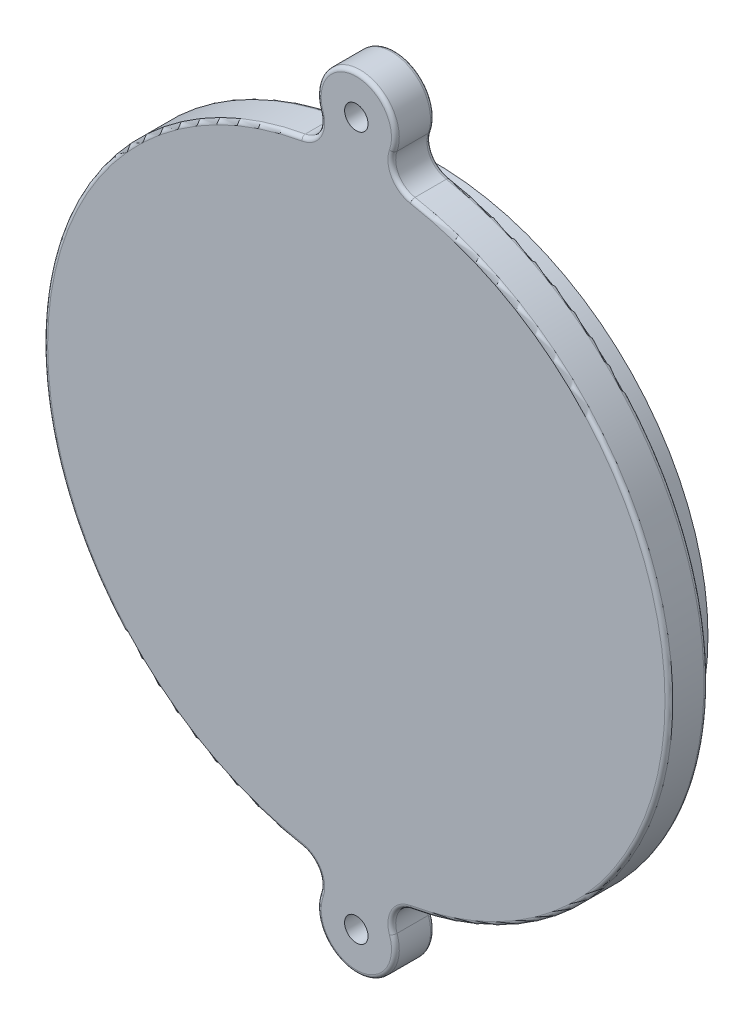
ISO-10303-21;
HEADER;
FILE_DESCRIPTION(('STEP AP214'),'2;1');
FILE_NAME('part.step','',(''),(''),'','','');
FILE_SCHEMA(('AUTOMOTIVE_DESIGN { 1 0 10303 214 1 1 1 1 }'));
ENDSEC;
DATA;
#1=APPLICATION_CONTEXT('core data for automotive mechanical design processes');
#2=APPLICATION_PROTOCOL_DEFINITION('international standard','automotive_design',2000,#1);
#3=PRODUCT_CONTEXT('',#1,'mechanical');
#4=PRODUCT('Part','Part','',(#3));
#5=PRODUCT_RELATED_PRODUCT_CATEGORY('part','',(#4));
#6=PRODUCT_DEFINITION_FORMATION('','',#4);
#7=PRODUCT_DEFINITION_CONTEXT('part definition',#1,'design');
#8=PRODUCT_DEFINITION('design','',#6,#7);
#9=PRODUCT_DEFINITION_SHAPE('','',#8);
#10=(LENGTH_UNIT() NAMED_UNIT(*) SI_UNIT(.MILLI.,.METRE.));
#11=(NAMED_UNIT(*) PLANE_ANGLE_UNIT() SI_UNIT($,.RADIAN.));
#12=(NAMED_UNIT(*) SI_UNIT($,.STERADIAN.) SOLID_ANGLE_UNIT());
#13=UNCERTAINTY_MEASURE_WITH_UNIT(LENGTH_MEASURE(1.E-05),#10,'distance_accuracy_value','');
#14=(GEOMETRIC_REPRESENTATION_CONTEXT(3) GLOBAL_UNCERTAINTY_ASSIGNED_CONTEXT((#13)) GLOBAL_UNIT_ASSIGNED_CONTEXT((#10,
#11,#12)) REPRESENTATION_CONTEXT('',''));
#15=CARTESIAN_POINT('',(0.,0.,0.));
#16=DIRECTION('',(0.,0.,1.));
#17=DIRECTION('',(1.,0.,0.));
#18=AXIS2_PLACEMENT_3D('',#15,#16,#17);
#19=CARTESIAN_POINT('',(0.,0.,-1.));
#20=DIRECTION('',(0.,0.,1.));
#21=DIRECTION('',(1.,0.,0.));
#22=AXIS2_PLACEMENT_3D('',#19,#20,#21);
#23=TOROIDAL_SURFACE('',#22,36.,1.);
#24=CARTESIAN_POINT('',(0.,0.,0.));
#25=DIRECTION('',(0.,0.,1.));
#26=DIRECTION('',(1.,0.,0.));
#27=AXIS2_PLACEMENT_3D('',#24,#25,#26);
#28=CIRCLE('',#27,36.);
#29=CARTESIAN_POINT('',(36.,0.,0.));
#30=VERTEX_POINT('',#29);
#31=EDGE_CURVE('E41',#30,#30,#28,.T.);
#32=ORIENTED_EDGE('',*,*,#31,.F.);
#33=EDGE_LOOP('',(#32));
#34=FACE_BOUND('',#33,.T.);
#35=CARTESIAN_POINT('',(0.,0.,-1.));
#36=DIRECTION('',(0.,0.,1.));
#37=DIRECTION('',(1.,0.,0.));
#38=AXIS2_PLACEMENT_3D('',#35,#36,#37);
#39=CIRCLE('',#38,35.);
#40=CARTESIAN_POINT('',(35.,0.,-1.));
#41=VERTEX_POINT('',#40);
#42=EDGE_CURVE('E11',#41,#41,#39,.F.);
#43=ORIENTED_EDGE('',*,*,#42,.F.);
#44=EDGE_LOOP('',(#43));
#45=FACE_BOUND('',#44,.T.);
#46=ADVANCED_FACE('F34',(#34,#45),#23,.F.);
#47=CARTESIAN_POINT('',(-3.77123616632825,43.6666666666667,5.));
#48=DIRECTION('',(0.,0.,1.));
#49=DIRECTION('',(1.,0.,0.));
#50=AXIS2_PLACEMENT_3D('',#47,#48,#49);
#51=PLANE('',#50);
#52=CARTESIAN_POINT('',(0.,-45.,5.));
#53=DIRECTION('',(0.,0.,1.));
#54=DIRECTION('',(1.,0.,0.));
#55=AXIS2_PLACEMENT_3D('',#52,#53,#54);
#56=CIRCLE('',#55,4.5);
#57=CARTESIAN_POINT('',(-4.24264068711928,-43.5,5.));
#58=VERTEX_POINT('',#57);
#59=CARTESIAN_POINT('',(4.24264068711929,-43.5,5.));
#60=VERTEX_POINT('',#59);
#61=EDGE_CURVE('E174',#58,#60,#56,.T.);
#62=ORIENTED_EDGE('',*,*,#61,.T.);
#63=CARTESIAN_POINT('',(7.54247233265651,-42.3333333333333,5.));
#64=DIRECTION('',(0.,0.,1.));
#65=DIRECTION('',(1.,0.,0.));
#66=AXIS2_PLACEMENT_3D('',#63,#64,#65);
#67=CIRCLE('',#66,3.5);
#68=CARTESIAN_POINT('',(6.92855016604491,-38.8875968992248,5.));
#69=VERTEX_POINT('',#68);
#70=EDGE_CURVE('E153',#60,#69,#67,.F.);
#71=ORIENTED_EDGE('',*,*,#70,.T.);
#72=CARTESIAN_POINT('',(0.,0.,5.));
#73=DIRECTION('',(0.,0.,1.));
#74=DIRECTION('',(1.,0.,0.));
#75=AXIS2_PLACEMENT_3D('',#72,#73,#74);
#76=CIRCLE('',#75,39.5);
#77=CARTESIAN_POINT('',(6.92855016604493,38.8875968992248,5.));
#78=VERTEX_POINT('',#77);
#79=EDGE_CURVE('E162',#69,#78,#76,.T.);
#80=ORIENTED_EDGE('',*,*,#79,.T.);
#81=CARTESIAN_POINT('',(7.54247233265651,42.3333333333333,5.));
#82=DIRECTION('',(0.,0.,1.));
#83=DIRECTION('',(1.,0.,0.));
#84=AXIS2_PLACEMENT_3D('',#81,#82,#83);
#85=CIRCLE('',#84,3.5);
#86=CARTESIAN_POINT('',(4.24264068711928,43.5,5.));
#87=VERTEX_POINT('',#86);
#88=EDGE_CURVE('E168',#78,#87,#85,.F.);
#89=ORIENTED_EDGE('',*,*,#88,.T.);
#90=CARTESIAN_POINT('',(0.,45.,5.));
#91=DIRECTION('',(0.,0.,1.));
#92=DIRECTION('',(1.,0.,0.));
#93=AXIS2_PLACEMENT_3D('',#90,#91,#92);
#94=CIRCLE('',#93,4.5);
#95=CARTESIAN_POINT('',(-4.24264068711928,43.5,5.));
#96=VERTEX_POINT('',#95);
#97=EDGE_CURVE('E326',#87,#96,#94,.T.);
#98=ORIENTED_EDGE('',*,*,#97,.T.);
#99=CARTESIAN_POINT('',(-7.54247233265651,42.3333333333333,5.));
#100=DIRECTION('',(0.,0.,1.));
#101=DIRECTION('',(1.,0.,0.));
#102=AXIS2_PLACEMENT_3D('',#99,#100,#101);
#103=CIRCLE('',#102,3.5);
#104=CARTESIAN_POINT('',(-6.92855016604493,38.8875968992248,5.));
#105=VERTEX_POINT('',#104);
#106=EDGE_CURVE('E328',#96,#105,#103,.F.);
#107=ORIENTED_EDGE('',*,*,#106,.T.);
#108=CARTESIAN_POINT('',(0.,0.,5.));
#109=DIRECTION('',(0.,0.,1.));
#110=DIRECTION('',(1.,0.,0.));
#111=AXIS2_PLACEMENT_3D('',#108,#109,#110);
#112=CIRCLE('',#111,39.5);
#113=CARTESIAN_POINT('',(-6.92855016604493,-38.8875968992248,5.));
#114=VERTEX_POINT('',#113);
#115=EDGE_CURVE('E330',#105,#114,#112,.T.);
#116=ORIENTED_EDGE('',*,*,#115,.T.);
#117=CARTESIAN_POINT('',(-7.54247233265651,-42.3333333333333,5.));
#118=DIRECTION('',(0.,0.,1.));
#119=DIRECTION('',(1.,0.,0.));
#120=AXIS2_PLACEMENT_3D('',#117,#118,#119);
#121=CIRCLE('',#120,3.5);
#122=EDGE_CURVE('E180',#114,#58,#121,.F.);
#123=ORIENTED_EDGE('',*,*,#122,.T.);
#124=EDGE_LOOP('',(#62,#71,#80,#89,#98,#107,#116,#123));
#125=FACE_BOUND('',#124,.T.);
#126=CARTESIAN_POINT('',(0.,45.,5.));
#127=DIRECTION('',(0.,0.,1.));
#128=DIRECTION('',(1.,0.,0.));
#129=AXIS2_PLACEMENT_3D('',#126,#127,#128);
#130=CIRCLE('',#129,1.5);
#131=CARTESIAN_POINT('',(1.5,45.,5.));
#132=VERTEX_POINT('',#131);
#133=EDGE_CURVE('E297',#132,#132,#130,.T.);
#134=ORIENTED_EDGE('',*,*,#133,.F.);
#135=EDGE_LOOP('',(#134));
#136=FACE_BOUND('',#135,.T.);
#137=CARTESIAN_POINT('',(0.,-45.,5.));
#138=DIRECTION('',(0.,0.,1.));
#139=DIRECTION('',(-1.,0.,0.));
#140=AXIS2_PLACEMENT_3D('',#137,#138,#139);
#141=CIRCLE('',#140,1.5);
#142=CARTESIAN_POINT('',(-1.5,-45.,5.));
#143=VERTEX_POINT('',#142);
#144=EDGE_CURVE('E288',#143,#143,#141,.T.);
#145=ORIENTED_EDGE('',*,*,#144,.F.);
#146=EDGE_LOOP('',(#145));
#147=FACE_BOUND('',#146,.T.);
#148=ADVANCED_FACE('F171',(#125,#136,#147),#51,.T.);
#149=CARTESIAN_POINT('',(-3.77123616632825,43.6666666666667,0.));
#150=DIRECTION('',(0.,0.,1.));
#151=DIRECTION('',(1.,0.,0.));
#152=AXIS2_PLACEMENT_3D('',#149,#150,#151);
#153=PLANE('',#152);
#154=ORIENTED_EDGE('',*,*,#31,.T.);
#155=EDGE_LOOP('',(#154));
#156=FACE_BOUND('',#155,.T.);
#157=CARTESIAN_POINT('',(0.,0.,0.));
#158=DIRECTION('',(0.,0.,1.));
#159=DIRECTION('',(1.,0.,0.));
#160=AXIS2_PLACEMENT_3D('',#157,#158,#159);
#161=CIRCLE('',#160,39.5);
#162=CARTESIAN_POINT('',(6.92855016604493,38.8875968992248,0.));
#163=VERTEX_POINT('',#162);
#164=CARTESIAN_POINT('',(6.92855016604491,-38.8875968992248,0.));
#165=VERTEX_POINT('',#164);
#166=EDGE_CURVE('E209',#163,#165,#161,.F.);
#167=ORIENTED_EDGE('',*,*,#166,.T.);
#168=CARTESIAN_POINT('',(7.54247233265651,-42.3333333333333,0.));
#169=DIRECTION('',(0.,0.,1.));
#170=DIRECTION('',(1.,0.,0.));
#171=AXIS2_PLACEMENT_3D('',#168,#169,#170);
#172=CIRCLE('',#171,3.5);
#173=CARTESIAN_POINT('',(4.24264068711929,-43.5,0.));
#174=VERTEX_POINT('',#173);
#175=EDGE_CURVE('E222',#165,#174,#172,.T.);
#176=ORIENTED_EDGE('',*,*,#175,.T.);
#177=CARTESIAN_POINT('',(0.,-45.,0.));
#178=DIRECTION('',(0.,0.,1.));
#179=DIRECTION('',(1.,0.,0.));
#180=AXIS2_PLACEMENT_3D('',#177,#178,#179);
#181=CIRCLE('',#180,4.5);
#182=CARTESIAN_POINT('',(-4.24264068711928,-43.5,0.));
#183=VERTEX_POINT('',#182);
#184=EDGE_CURVE('E55',#174,#183,#181,.F.);
#185=ORIENTED_EDGE('',*,*,#184,.T.);
#186=CARTESIAN_POINT('',(-7.54247233265651,-42.3333333333333,0.));
#187=DIRECTION('',(0.,0.,1.));
#188=DIRECTION('',(1.,0.,0.));
#189=AXIS2_PLACEMENT_3D('',#186,#187,#188);
#190=CIRCLE('',#189,3.5);
#191=CARTESIAN_POINT('',(-6.92855016604493,-38.8875968992248,0.));
#192=VERTEX_POINT('',#191);
#193=EDGE_CURVE('E219',#183,#192,#190,.T.);
#194=ORIENTED_EDGE('',*,*,#193,.T.);
#195=CARTESIAN_POINT('',(0.,0.,0.));
#196=DIRECTION('',(0.,0.,1.));
#197=DIRECTION('',(1.,0.,0.));
#198=AXIS2_PLACEMENT_3D('',#195,#196,#197);
#199=CIRCLE('',#198,39.5);
#200=CARTESIAN_POINT('',(-6.92855016604493,38.8875968992248,0.));
#201=VERTEX_POINT('',#200);
#202=EDGE_CURVE('E217',#192,#201,#199,.F.);
#203=ORIENTED_EDGE('',*,*,#202,.T.);
#204=CARTESIAN_POINT('',(-7.54247233265651,42.3333333333333,0.));
#205=DIRECTION('',(0.,0.,1.));
#206=DIRECTION('',(1.,0.,0.));
#207=AXIS2_PLACEMENT_3D('',#204,#205,#206);
#208=CIRCLE('',#207,3.5);
#209=CARTESIAN_POINT('',(-4.24264068711928,43.5,0.));
#210=VERTEX_POINT('',#209);
#211=EDGE_CURVE('E215',#201,#210,#208,.T.);
#212=ORIENTED_EDGE('',*,*,#211,.T.);
#213=CARTESIAN_POINT('',(0.,45.,0.));
#214=DIRECTION('',(0.,0.,1.));
#215=DIRECTION('',(1.,0.,0.));
#216=AXIS2_PLACEMENT_3D('',#213,#214,#215);
#217=CIRCLE('',#216,4.5);
#218=CARTESIAN_POINT('',(4.24264068711928,43.5,0.));
#219=VERTEX_POINT('',#218);
#220=EDGE_CURVE('E213',#210,#219,#217,.F.);
#221=ORIENTED_EDGE('',*,*,#220,.T.);
#222=CARTESIAN_POINT('',(7.54247233265651,42.3333333333333,0.));
#223=DIRECTION('',(0.,0.,1.));
#224=DIRECTION('',(1.,0.,0.));
#225=AXIS2_PLACEMENT_3D('',#222,#223,#224);
#226=CIRCLE('',#225,3.5);
#227=EDGE_CURVE('E211',#219,#163,#226,.T.);
#228=ORIENTED_EDGE('',*,*,#227,.T.);
#229=EDGE_LOOP('',(#167,#176,#185,#194,#203,#212,#221,#228));
#230=FACE_BOUND('',#229,.T.);
#231=CARTESIAN_POINT('',(0.,45.,0.));
#232=DIRECTION('',(0.,0.,1.));
#233=DIRECTION('',(1.,0.,0.));
#234=AXIS2_PLACEMENT_3D('',#231,#232,#233);
#235=CIRCLE('',#234,1.5);
#236=CARTESIAN_POINT('',(1.5,45.,0.));
#237=VERTEX_POINT('',#236);
#238=EDGE_CURVE('E295',#237,#237,#235,.T.);
#239=ORIENTED_EDGE('',*,*,#238,.T.);
#240=EDGE_LOOP('',(#239));
#241=FACE_BOUND('',#240,.T.);
#242=CARTESIAN_POINT('',(0.,-45.,0.));
#243=DIRECTION('',(0.,0.,1.));
#244=DIRECTION('',(-1.,0.,0.));
#245=AXIS2_PLACEMENT_3D('',#242,#243,#244);
#246=CIRCLE('',#245,1.5);
#247=CARTESIAN_POINT('',(-1.5,-45.,0.));
#248=VERTEX_POINT('',#247);
#249=EDGE_CURVE('E284',#248,#248,#246,.T.);
#250=ORIENTED_EDGE('',*,*,#249,.T.);
#251=EDGE_LOOP('',(#250));
#252=FACE_BOUND('',#251,.T.);
#253=ADVANCED_FACE('F268',(#156,#230,#241,#252),#153,.F.);
#254=CARTESIAN_POINT('',(-7.54247233265651,42.3333333333333,5.));
#255=DIRECTION('',(0.,0.,-1.));
#256=DIRECTION('',(-1.,0.,0.));
#257=AXIS2_PLACEMENT_3D('',#254,#255,#256);
#258=CYLINDRICAL_SURFACE('',#257,3.);
#259=DIRECTION('',(0.,0.,-1.));
#260=VECTOR('',#259,1.);
#261=CARTESIAN_POINT('',(-7.01625333270372,39.3798449612403,5.));
#262=LINE('',#261,#260);
#263=CARTESIAN_POINT('',(-7.01625333270372,39.3798449612403,4.5));
#264=VERTEX_POINT('',#263);
#265=CARTESIAN_POINT('',(-7.01625333270372,39.3798449612403,0.5));
#266=VERTEX_POINT('',#265);
#267=EDGE_CURVE('E169',#264,#266,#262,.T.);
#268=ORIENTED_EDGE('',*,*,#267,.F.);
#269=CARTESIAN_POINT('',(-7.54247233265651,42.3333333333333,4.5));
#270=DIRECTION('',(0.,0.,1.));
#271=DIRECTION('',(1.,0.,0.));
#272=AXIS2_PLACEMENT_3D('',#269,#270,#271);
#273=CIRCLE('',#272,3.);
#274=CARTESIAN_POINT('',(-4.71404520791031,43.3333333333333,4.5));
#275=VERTEX_POINT('',#274);
#276=EDGE_CURVE('E199',#264,#275,#273,.T.);
#277=ORIENTED_EDGE('',*,*,#276,.T.);
#278=DIRECTION('',(0.,0.,-1.));
#279=VECTOR('',#278,1.);
#280=CARTESIAN_POINT('',(-4.71404520791031,43.3333333333333,5.));
#281=LINE('',#280,#279);
#282=CARTESIAN_POINT('',(-4.71404520791031,43.3333333333333,0.5));
#283=VERTEX_POINT('',#282);
#284=EDGE_CURVE('E300',#275,#283,#281,.T.);
#285=ORIENTED_EDGE('',*,*,#284,.T.);
#286=CARTESIAN_POINT('',(-7.54247233265651,42.3333333333333,0.5));
#287=DIRECTION('',(0.,0.,1.));
#288=DIRECTION('',(1.,0.,0.));
#289=AXIS2_PLACEMENT_3D('',#286,#287,#288);
#290=CIRCLE('',#289,3.);
#291=EDGE_CURVE('E197',#283,#266,#290,.F.);
#292=ORIENTED_EDGE('',*,*,#291,.T.);
#293=EDGE_LOOP('',(#268,#277,#285,#292));
#294=FACE_BOUND('',#293,.T.);
#295=ADVANCED_FACE('F383',(#294),#258,.F.);
#296=CARTESIAN_POINT('',(0.,0.,5.));
#297=DIRECTION('',(0.,0.,-1.));
#298=DIRECTION('',(-1.,0.,0.));
#299=AXIS2_PLACEMENT_3D('',#296,#297,#298);
#300=CYLINDRICAL_SURFACE('',#299,40.);
#301=DIRECTION('',(0.,0.,-1.));
#302=VECTOR('',#301,1.);
#303=CARTESIAN_POINT('',(-7.01625333270373,-39.3798449612403,5.));
#304=LINE('',#303,#302);
#305=CARTESIAN_POINT('',(-7.01625333270373,-39.3798449612403,4.5));
#306=VERTEX_POINT('',#305);
#307=CARTESIAN_POINT('',(-7.01625333270373,-39.3798449612403,0.5));
#308=VERTEX_POINT('',#307);
#309=EDGE_CURVE('E320',#306,#308,#304,.T.);
#310=ORIENTED_EDGE('',*,*,#309,.F.);
#311=CARTESIAN_POINT('',(0.,0.,4.5));
#312=DIRECTION('',(0.,0.,1.));
#313=DIRECTION('',(1.,0.,0.));
#314=AXIS2_PLACEMENT_3D('',#311,#312,#313);
#315=CIRCLE('',#314,40.);
#316=EDGE_CURVE('E195',#306,#264,#315,.F.);
#317=ORIENTED_EDGE('',*,*,#316,.T.);
#318=ORIENTED_EDGE('',*,*,#267,.T.);
#319=CARTESIAN_POINT('',(0.,0.,0.5));
#320=DIRECTION('',(0.,0.,1.));
#321=DIRECTION('',(1.,0.,0.));
#322=AXIS2_PLACEMENT_3D('',#319,#320,#321);
#323=CIRCLE('',#322,40.);
#324=EDGE_CURVE('E193',#266,#308,#323,.T.);
#325=ORIENTED_EDGE('',*,*,#324,.T.);
#326=EDGE_LOOP('',(#310,#317,#318,#325));
#327=FACE_BOUND('',#326,.T.);
#328=ADVANCED_FACE('F380',(#327),#300,.T.);
#329=CARTESIAN_POINT('',(-7.54247233265651,-42.3333333333333,5.));
#330=DIRECTION('',(0.,0.,-1.));
#331=DIRECTION('',(-1.,0.,0.));
#332=AXIS2_PLACEMENT_3D('',#329,#330,#331);
#333=CYLINDRICAL_SURFACE('',#332,3.);
#334=DIRECTION('',(0.,0.,-1.));
#335=VECTOR('',#334,1.);
#336=CARTESIAN_POINT('',(-4.71404520791031,-43.3333333333333,5.));
#337=LINE('',#336,#335);
#338=CARTESIAN_POINT('',(-4.71404520791031,-43.3333333333333,4.5));
#339=VERTEX_POINT('',#338);
#340=CARTESIAN_POINT('',(-4.71404520791031,-43.3333333333333,0.5));
#341=VERTEX_POINT('',#340);
#342=EDGE_CURVE('E317',#339,#341,#337,.T.);
#343=ORIENTED_EDGE('',*,*,#342,.F.);
#344=CARTESIAN_POINT('',(-7.54247233265651,-42.3333333333333,4.5));
#345=DIRECTION('',(0.,0.,1.));
#346=DIRECTION('',(1.,0.,0.));
#347=AXIS2_PLACEMENT_3D('',#344,#345,#346);
#348=CIRCLE('',#347,3.);
#349=EDGE_CURVE('E191',#339,#306,#348,.T.);
#350=ORIENTED_EDGE('',*,*,#349,.T.);
#351=ORIENTED_EDGE('',*,*,#309,.T.);
#352=CARTESIAN_POINT('',(-7.54247233265651,-42.3333333333333,0.5));
#353=DIRECTION('',(0.,0.,1.));
#354=DIRECTION('',(1.,0.,0.));
#355=AXIS2_PLACEMENT_3D('',#352,#353,#354);
#356=CIRCLE('',#355,3.);
#357=EDGE_CURVE('E189',#308,#341,#356,.F.);
#358=ORIENTED_EDGE('',*,*,#357,.T.);
#359=EDGE_LOOP('',(#343,#350,#351,#358));
#360=FACE_BOUND('',#359,.T.);
#361=ADVANCED_FACE('F405',(#360),#333,.F.);
#362=CARTESIAN_POINT('',(0.,-45.,5.));
#363=DIRECTION('',(0.,0.,-1.));
#364=DIRECTION('',(-1.,0.,0.));
#365=AXIS2_PLACEMENT_3D('',#362,#363,#364);
#366=CYLINDRICAL_SURFACE('',#365,4.99999999999999);
#367=DIRECTION('',(0.,0.,-1.));
#368=VECTOR('',#367,1.);
#369=CARTESIAN_POINT('',(4.71404520791031,-43.3333333333333,5.));
#370=LINE('',#369,#368);
#371=CARTESIAN_POINT('',(4.71404520791031,-43.3333333333333,4.5));
#372=VERTEX_POINT('',#371);
#373=CARTESIAN_POINT('',(4.71404520791031,-43.3333333333333,0.5));
#374=VERTEX_POINT('',#373);
#375=EDGE_CURVE('E314',#372,#374,#370,.T.);
#376=ORIENTED_EDGE('',*,*,#375,.F.);
#377=CARTESIAN_POINT('',(0.,-45.,4.5));
#378=DIRECTION('',(0.,0.,1.));
#379=DIRECTION('',(1.,0.,0.));
#380=AXIS2_PLACEMENT_3D('',#377,#378,#379);
#381=CIRCLE('',#380,4.99999999999999);
#382=EDGE_CURVE('E187',#372,#339,#381,.F.);
#383=ORIENTED_EDGE('',*,*,#382,.T.);
#384=ORIENTED_EDGE('',*,*,#342,.T.);
#385=CARTESIAN_POINT('',(0.,-45.,0.5));
#386=DIRECTION('',(0.,0.,1.));
#387=DIRECTION('',(1.,0.,0.));
#388=AXIS2_PLACEMENT_3D('',#385,#386,#387);
#389=CIRCLE('',#388,4.99999999999999);
#390=EDGE_CURVE('E185',#341,#374,#389,.T.);
#391=ORIENTED_EDGE('',*,*,#390,.T.);
#392=EDGE_LOOP('',(#376,#383,#384,#391));
#393=FACE_BOUND('',#392,.T.);
#394=ADVANCED_FACE('F347',(#393),#366,.T.);
#395=CARTESIAN_POINT('',(7.54247233265651,-42.3333333333333,5.));
#396=DIRECTION('',(0.,0.,-1.));
#397=DIRECTION('',(-1.,0.,0.));
#398=AXIS2_PLACEMENT_3D('',#395,#396,#397);
#399=CYLINDRICAL_SURFACE('',#398,3.);
#400=DIRECTION('',(0.,0.,-1.));
#401=VECTOR('',#400,1.);
#402=CARTESIAN_POINT('',(7.01625333270371,-39.3798449612403,5.));
#403=LINE('',#402,#401);
#404=CARTESIAN_POINT('',(7.01625333270371,-39.3798449612403,4.5));
#405=VERTEX_POINT('',#404);
#406=CARTESIAN_POINT('',(7.01625333270371,-39.3798449612403,0.5));
#407=VERTEX_POINT('',#406);
#408=EDGE_CURVE('E311',#405,#407,#403,.T.);
#409=ORIENTED_EDGE('',*,*,#408,.F.);
#410=CARTESIAN_POINT('',(7.54247233265651,-42.3333333333333,4.5));
#411=DIRECTION('',(0.,0.,1.));
#412=DIRECTION('',(1.,0.,0.));
#413=AXIS2_PLACEMENT_3D('',#410,#411,#412);
#414=CIRCLE('',#413,3.);
#415=EDGE_CURVE('E155',#405,#372,#414,.T.);
#416=ORIENTED_EDGE('',*,*,#415,.T.);
#417=ORIENTED_EDGE('',*,*,#375,.T.);
#418=CARTESIAN_POINT('',(7.54247233265651,-42.3333333333333,0.5));
#419=DIRECTION('',(0.,0.,1.));
#420=DIRECTION('',(1.,0.,0.));
#421=AXIS2_PLACEMENT_3D('',#418,#419,#420);
#422=CIRCLE('',#421,3.);
#423=EDGE_CURVE('E176',#374,#407,#422,.F.);
#424=ORIENTED_EDGE('',*,*,#423,.T.);
#425=EDGE_LOOP('',(#409,#416,#417,#424));
#426=FACE_BOUND('',#425,.T.);
#427=ADVANCED_FACE('F346',(#426),#399,.F.);
#428=CARTESIAN_POINT('',(0.,0.,5.));
#429=DIRECTION('',(0.,0.,-1.));
#430=DIRECTION('',(-1.,0.,0.));
#431=AXIS2_PLACEMENT_3D('',#428,#429,#430);
#432=CYLINDRICAL_SURFACE('',#431,40.);
#433=DIRECTION('',(0.,0.,-1.));
#434=VECTOR('',#433,1.);
#435=CARTESIAN_POINT('',(7.01625333270373,39.3798449612403,5.));
#436=LINE('',#435,#434);
#437=CARTESIAN_POINT('',(7.01625333270373,39.3798449612403,4.5));
#438=VERTEX_POINT('',#437);
#439=CARTESIAN_POINT('',(7.01625333270373,39.3798449612403,0.5));
#440=VERTEX_POINT('',#439);
#441=EDGE_CURVE('E308',#438,#440,#436,.T.);
#442=ORIENTED_EDGE('',*,*,#441,.F.);
#443=CARTESIAN_POINT('',(0.,0.,4.5));
#444=DIRECTION('',(0.,0.,1.));
#445=DIRECTION('',(1.,0.,0.));
#446=AXIS2_PLACEMENT_3D('',#443,#444,#445);
#447=CIRCLE('',#446,40.);
#448=EDGE_CURVE('E226',#438,#405,#447,.F.);
#449=ORIENTED_EDGE('',*,*,#448,.T.);
#450=ORIENTED_EDGE('',*,*,#408,.T.);
#451=CARTESIAN_POINT('',(0.,0.,0.5));
#452=DIRECTION('',(0.,0.,1.));
#453=DIRECTION('',(1.,0.,0.));
#454=AXIS2_PLACEMENT_3D('',#451,#452,#453);
#455=CIRCLE('',#454,40.);
#456=EDGE_CURVE('E224',#407,#440,#455,.T.);
#457=ORIENTED_EDGE('',*,*,#456,.T.);
#458=EDGE_LOOP('',(#442,#449,#450,#457));
#459=FACE_BOUND('',#458,.T.);
#460=ADVANCED_FACE('F357',(#459),#432,.T.);
#461=CARTESIAN_POINT('',(7.54247233265651,42.3333333333333,5.));
#462=DIRECTION('',(0.,0.,-1.));
#463=DIRECTION('',(-1.,0.,0.));
#464=AXIS2_PLACEMENT_3D('',#461,#462,#463);
#465=CYLINDRICAL_SURFACE('',#464,3.);
#466=DIRECTION('',(0.,0.,-1.));
#467=VECTOR('',#466,1.);
#468=CARTESIAN_POINT('',(4.71404520791032,43.3333333333333,5.));
#469=LINE('',#468,#467);
#470=CARTESIAN_POINT('',(4.71404520791032,43.3333333333333,4.5));
#471=VERTEX_POINT('',#470);
#472=CARTESIAN_POINT('',(4.71404520791032,43.3333333333333,0.5));
#473=VERTEX_POINT('',#472);
#474=EDGE_CURVE('E305',#471,#473,#469,.T.);
#475=ORIENTED_EDGE('',*,*,#474,.F.);
#476=CARTESIAN_POINT('',(7.54247233265651,42.3333333333333,4.5));
#477=DIRECTION('',(0.,0.,1.));
#478=DIRECTION('',(1.,0.,0.));
#479=AXIS2_PLACEMENT_3D('',#476,#477,#478);
#480=CIRCLE('',#479,3.);
#481=EDGE_CURVE('E207',#471,#438,#480,.T.);
#482=ORIENTED_EDGE('',*,*,#481,.T.);
#483=ORIENTED_EDGE('',*,*,#441,.T.);
#484=CARTESIAN_POINT('',(7.54247233265651,42.3333333333333,0.5));
#485=DIRECTION('',(0.,0.,1.));
#486=DIRECTION('',(1.,0.,0.));
#487=AXIS2_PLACEMENT_3D('',#484,#485,#486);
#488=CIRCLE('',#487,3.);
#489=EDGE_CURVE('E205',#440,#473,#488,.F.);
#490=ORIENTED_EDGE('',*,*,#489,.T.);
#491=EDGE_LOOP('',(#475,#482,#483,#490));
#492=FACE_BOUND('',#491,.T.);
#493=ADVANCED_FACE('F594',(#492),#465,.F.);
#494=CARTESIAN_POINT('',(0.,45.,5.));
#495=DIRECTION('',(0.,0.,-1.));
#496=DIRECTION('',(-1.,0.,0.));
#497=AXIS2_PLACEMENT_3D('',#494,#495,#496);
#498=CYLINDRICAL_SURFACE('',#497,4.99999999999999);
#499=ORIENTED_EDGE('',*,*,#284,.F.);
#500=CARTESIAN_POINT('',(0.,45.,4.5));
#501=DIRECTION('',(0.,0.,1.));
#502=DIRECTION('',(1.,0.,0.));
#503=AXIS2_PLACEMENT_3D('',#500,#501,#502);
#504=CIRCLE('',#503,4.99999999999999);
#505=EDGE_CURVE('E203',#275,#471,#504,.F.);
#506=ORIENTED_EDGE('',*,*,#505,.T.);
#507=ORIENTED_EDGE('',*,*,#474,.T.);
#508=CARTESIAN_POINT('',(0.,45.,0.5));
#509=DIRECTION('',(0.,0.,1.));
#510=DIRECTION('',(1.,0.,0.));
#511=AXIS2_PLACEMENT_3D('',#508,#509,#510);
#512=CIRCLE('',#511,4.99999999999999);
#513=EDGE_CURVE('E201',#473,#283,#512,.T.);
#514=ORIENTED_EDGE('',*,*,#513,.T.);
#515=EDGE_LOOP('',(#499,#506,#507,#514));
#516=FACE_BOUND('',#515,.T.);
#517=ADVANCED_FACE('F588',(#516),#498,.T.);
#518=CARTESIAN_POINT('',(0.,45.,5.));
#519=DIRECTION('',(0.,0.,-1.));
#520=DIRECTION('',(-1.,0.,0.));
#521=AXIS2_PLACEMENT_3D('',#518,#519,#520);
#522=CYLINDRICAL_SURFACE('',#521,1.5);
#523=ORIENTED_EDGE('',*,*,#133,.T.);
#524=EDGE_LOOP('',(#523));
#525=FACE_BOUND('',#524,.T.);
#526=ORIENTED_EDGE('',*,*,#238,.F.);
#527=EDGE_LOOP('',(#526));
#528=FACE_BOUND('',#527,.T.);
#529=ADVANCED_FACE('F593',(#525,#528),#522,.F.);
#530=CARTESIAN_POINT('',(0.,-45.,5.));
#531=DIRECTION('',(0.,0.,-1.));
#532=DIRECTION('',(-1.,0.,0.));
#533=AXIS2_PLACEMENT_3D('',#530,#531,#532);
#534=CYLINDRICAL_SURFACE('',#533,1.5);
#535=ORIENTED_EDGE('',*,*,#144,.T.);
#536=EDGE_LOOP('',(#535));
#537=FACE_BOUND('',#536,.T.);
#538=ORIENTED_EDGE('',*,*,#249,.F.);
#539=EDGE_LOOP('',(#538));
#540=FACE_BOUND('',#539,.T.);
#541=ADVANCED_FACE('F660',(#537,#540),#534,.F.);
#542=CARTESIAN_POINT('',(0.,0.,-5.));
#543=DIRECTION('',(0.,0.,-1.));
#544=DIRECTION('',(-1.,0.,0.));
#545=AXIS2_PLACEMENT_3D('',#542,#543,#544);
#546=PLANE('',#545);
#547=CARTESIAN_POINT('',(0.,0.,-5.));
#548=DIRECTION('',(0.,0.,-1.));
#549=DIRECTION('',(-1.,0.,0.));
#550=AXIS2_PLACEMENT_3D('',#547,#548,#549);
#551=CIRCLE('',#550,35.);
#552=CARTESIAN_POINT('',(-35.,0.,-5.));
#553=VERTEX_POINT('',#552);
#554=EDGE_CURVE('E282',#553,#553,#551,.T.);
#555=ORIENTED_EDGE('',*,*,#554,.T.);
#556=EDGE_LOOP('',(#555));
#557=FACE_BOUND('',#556,.T.);
#558=CARTESIAN_POINT('',(0.,0.,-5.));
#559=DIRECTION('',(0.,0.,-1.));
#560=DIRECTION('',(-1.,0.,0.));
#561=AXIS2_PLACEMENT_3D('',#558,#559,#560);
#562=CIRCLE('',#561,30.015);
#563=CARTESIAN_POINT('',(-30.015,0.,-5.));
#564=VERTEX_POINT('',#563);
#565=EDGE_CURVE('E285',#564,#564,#562,.T.);
#566=ORIENTED_EDGE('',*,*,#565,.F.);
#567=EDGE_LOOP('',(#566));
#568=FACE_BOUND('',#567,.T.);
#569=ADVANCED_FACE('F278',(#557,#568),#546,.T.);
#570=CARTESIAN_POINT('',(0.,0.,-5.));
#571=DIRECTION('',(0.,0.,1.));
#572=DIRECTION('',(1.,0.,0.));
#573=AXIS2_PLACEMENT_3D('',#570,#571,#572);
#574=CYLINDRICAL_SURFACE('',#573,35.);
#575=ORIENTED_EDGE('',*,*,#42,.T.);
#576=EDGE_LOOP('',(#575));
#577=FACE_BOUND('',#576,.T.);
#578=ORIENTED_EDGE('',*,*,#554,.F.);
#579=EDGE_LOOP('',(#578));
#580=FACE_BOUND('',#579,.T.);
#581=ADVANCED_FACE('F274',(#577,#580),#574,.T.);
#582=CARTESIAN_POINT('',(0.,0.,-5.));
#583=DIRECTION('',(0.,0.,1.));
#584=DIRECTION('',(1.,0.,0.));
#585=AXIS2_PLACEMENT_3D('',#582,#583,#584);
#586=CYLINDRICAL_SURFACE('',#585,30.015);
#587=ORIENTED_EDGE('',*,*,#565,.T.);
#588=EDGE_LOOP('',(#587));
#589=FACE_BOUND('',#588,.T.);
#590=CARTESIAN_POINT('',(0.,0.,0.));
#591=DIRECTION('',(0.,0.,-1.));
#592=DIRECTION('',(-1.,0.,0.));
#593=AXIS2_PLACEMENT_3D('',#590,#591,#592);
#594=CIRCLE('',#593,30.015);
#595=CARTESIAN_POINT('',(-30.015,0.,0.));
#596=VERTEX_POINT('',#595);
#597=EDGE_CURVE('E245',#596,#596,#594,.T.);
#598=ORIENTED_EDGE('',*,*,#597,.F.);
#599=EDGE_LOOP('',(#598));
#600=FACE_BOUND('',#599,.T.);
#601=ADVANCED_FACE('F277',(#589,#600),#586,.F.);
#602=ORIENTED_EDGE('',*,*,#597,.T.);
#603=EDGE_LOOP('',(#602));
#604=FACE_BOUND('',#603,.T.);
#605=ADVANCED_FACE('F445',(#604),#153,.F.);
#606=CARTESIAN_POINT('',(-7.54247233265651,42.3333333333333,4.5));
#607=DIRECTION('',(0.,0.,1.));
#608=DIRECTION('',(1.,0.,0.));
#609=AXIS2_PLACEMENT_3D('',#606,#607,#608);
#610=TOROIDAL_SURFACE('',#609,3.5,0.5);
#611=CARTESIAN_POINT('',(-4.24264068711928,43.5,4.5));
#612=DIRECTION('',(-0.333333333333338,0.942809041582062,0.));
#613=DIRECTION('',(-0.942809041582062,-0.333333333333338,0.));
#614=AXIS2_PLACEMENT_3D('',#611,#612,#613);
#615=CIRCLE('',#614,0.5);
#616=EDGE_CURVE('E239',#275,#96,#615,.T.);
#617=ORIENTED_EDGE('',*,*,#616,.F.);
#618=ORIENTED_EDGE('',*,*,#276,.F.);
#619=CARTESIAN_POINT('',(-6.92855016604493,38.8875968992248,4.5));
#620=DIRECTION('',(-0.984496124031008,-0.175406333317592,0.));
#621=DIRECTION('',(0.175406333317592,-0.984496124031008,0.));
#622=AXIS2_PLACEMENT_3D('',#619,#620,#621);
#623=CIRCLE('',#622,0.5);
#624=EDGE_CURVE('E242',#105,#264,#623,.T.);
#625=ORIENTED_EDGE('',*,*,#624,.F.);
#626=ORIENTED_EDGE('',*,*,#106,.F.);
#627=EDGE_LOOP('',(#617,#618,#625,#626));
#628=FACE_BOUND('',#627,.T.);
#629=ADVANCED_FACE('F372',(#628),#610,.T.);
#630=CARTESIAN_POINT('',(0.,0.,4.5));
#631=DIRECTION('',(0.,0.,1.));
#632=DIRECTION('',(1.,0.,0.));
#633=AXIS2_PLACEMENT_3D('',#630,#631,#632);
#634=TOROIDAL_SURFACE('',#633,39.5,0.5);
#635=ORIENTED_EDGE('',*,*,#624,.T.);
#636=ORIENTED_EDGE('',*,*,#316,.F.);
#637=CARTESIAN_POINT('',(-6.92855016604493,-38.8875968992248,4.5));
#638=DIRECTION('',(0.984496124031008,-0.175406333317593,0.));
#639=DIRECTION('',(0.175406333317593,0.984496124031008,0.));
#640=AXIS2_PLACEMENT_3D('',#637,#638,#639);
#641=CIRCLE('',#640,0.5);
#642=EDGE_CURVE('E236',#114,#306,#641,.T.);
#643=ORIENTED_EDGE('',*,*,#642,.F.);
#644=ORIENTED_EDGE('',*,*,#115,.F.);
#645=EDGE_LOOP('',(#635,#636,#643,#644));
#646=FACE_BOUND('',#645,.T.);
#647=ADVANCED_FACE('F376',(#646),#634,.T.);
#648=CARTESIAN_POINT('',(0.,45.,4.5));
#649=DIRECTION('',(0.,0.,1.));
#650=DIRECTION('',(1.,0.,0.));
#651=AXIS2_PLACEMENT_3D('',#648,#649,#650);
#652=TOROIDAL_SURFACE('',#651,4.5,0.5);
#653=ORIENTED_EDGE('',*,*,#616,.T.);
#654=ORIENTED_EDGE('',*,*,#97,.F.);
#655=CARTESIAN_POINT('',(4.24264068711929,43.5,4.5));
#656=DIRECTION('',(-0.333333333333338,-0.942809041582062,0.));
#657=DIRECTION('',(0.942809041582062,-0.333333333333338,0.));
#658=AXIS2_PLACEMENT_3D('',#655,#656,#657);
#659=CIRCLE('',#658,0.5);
#660=EDGE_CURVE('E233',#471,#87,#659,.T.);
#661=ORIENTED_EDGE('',*,*,#660,.F.);
#662=ORIENTED_EDGE('',*,*,#505,.F.);
#663=EDGE_LOOP('',(#653,#654,#661,#662));
#664=FACE_BOUND('',#663,.T.);
#665=ADVANCED_FACE('F367',(#664),#652,.T.);
#666=CARTESIAN_POINT('',(-7.54247233265651,-42.3333333333333,4.5));
#667=DIRECTION('',(0.,0.,1.));
#668=DIRECTION('',(1.,0.,0.));
#669=AXIS2_PLACEMENT_3D('',#666,#667,#668);
#670=TOROIDAL_SURFACE('',#669,3.5,0.5);
#671=ORIENTED_EDGE('',*,*,#642,.T.);
#672=ORIENTED_EDGE('',*,*,#349,.F.);
#673=CARTESIAN_POINT('',(-4.24264068711928,-43.5,4.5));
#674=DIRECTION('',(-0.333333333333338,-0.942809041582062,0.));
#675=DIRECTION('',(0.942809041582062,-0.333333333333338,0.));
#676=AXIS2_PLACEMENT_3D('',#673,#674,#675);
#677=CIRCLE('',#676,0.5);
#678=EDGE_CURVE('E230',#58,#339,#677,.T.);
#679=ORIENTED_EDGE('',*,*,#678,.F.);
#680=ORIENTED_EDGE('',*,*,#122,.F.);
#681=EDGE_LOOP('',(#671,#672,#679,#680));
#682=FACE_BOUND('',#681,.T.);
#683=ADVANCED_FACE('F337',(#682),#670,.T.);
#684=CARTESIAN_POINT('',(7.54247233265651,42.3333333333333,4.5));
#685=DIRECTION('',(0.,0.,1.));
#686=DIRECTION('',(1.,0.,0.));
#687=AXIS2_PLACEMENT_3D('',#684,#685,#686);
#688=TOROIDAL_SURFACE('',#687,3.5,0.5);
#689=ORIENTED_EDGE('',*,*,#660,.T.);
#690=ORIENTED_EDGE('',*,*,#88,.F.);
#691=CARTESIAN_POINT('',(6.92855016604493,38.8875968992248,4.5));
#692=DIRECTION('',(0.984496124031008,-0.175406333317593,0.));
#693=DIRECTION('',(0.175406333317593,0.984496124031008,0.));
#694=AXIS2_PLACEMENT_3D('',#691,#692,#693);
#695=CIRCLE('',#694,0.5);
#696=EDGE_CURVE('E165',#438,#78,#695,.T.);
#697=ORIENTED_EDGE('',*,*,#696,.F.);
#698=ORIENTED_EDGE('',*,*,#481,.F.);
#699=EDGE_LOOP('',(#689,#690,#697,#698));
#700=FACE_BOUND('',#699,.T.);
#701=ADVANCED_FACE('F362',(#700),#688,.T.);
#702=CARTESIAN_POINT('',(0.,-45.,4.5));
#703=DIRECTION('',(0.,0.,1.));
#704=DIRECTION('',(1.,0.,0.));
#705=AXIS2_PLACEMENT_3D('',#702,#703,#704);
#706=TOROIDAL_SURFACE('',#705,4.5,0.5);
#707=ORIENTED_EDGE('',*,*,#678,.T.);
#708=ORIENTED_EDGE('',*,*,#382,.F.);
#709=CARTESIAN_POINT('',(4.24264068711929,-43.5,4.5));
#710=DIRECTION('',(-0.333333333333338,0.942809041582062,0.));
#711=DIRECTION('',(-0.942809041582062,-0.333333333333338,0.));
#712=AXIS2_PLACEMENT_3D('',#709,#710,#711);
#713=CIRCLE('',#712,0.5);
#714=EDGE_CURVE('E158',#60,#372,#713,.T.);
#715=ORIENTED_EDGE('',*,*,#714,.F.);
#716=ORIENTED_EDGE('',*,*,#61,.F.);
#717=EDGE_LOOP('',(#707,#708,#715,#716));
#718=FACE_BOUND('',#717,.T.);
#719=ADVANCED_FACE('F340',(#718),#706,.T.);
#720=CARTESIAN_POINT('',(0.,0.,4.5));
#721=DIRECTION('',(0.,0.,1.));
#722=DIRECTION('',(1.,0.,0.));
#723=AXIS2_PLACEMENT_3D('',#720,#721,#722);
#724=TOROIDAL_SURFACE('',#723,39.5,0.5);
#725=ORIENTED_EDGE('',*,*,#696,.T.);
#726=ORIENTED_EDGE('',*,*,#79,.F.);
#727=CARTESIAN_POINT('',(6.92855016604491,-38.8875968992248,4.5));
#728=DIRECTION('',(-0.984496124031008,-0.175406333317593,0.));
#729=DIRECTION('',(0.175406333317593,-0.984496124031008,0.));
#730=AXIS2_PLACEMENT_3D('',#727,#728,#729);
#731=CIRCLE('',#730,0.5);
#732=EDGE_CURVE('E149',#405,#69,#731,.T.);
#733=ORIENTED_EDGE('',*,*,#732,.F.);
#734=ORIENTED_EDGE('',*,*,#448,.F.);
#735=EDGE_LOOP('',(#725,#726,#733,#734));
#736=FACE_BOUND('',#735,.T.);
#737=ADVANCED_FACE('F163',(#736),#724,.T.);
#738=CARTESIAN_POINT('',(7.54247233265651,-42.3333333333333,4.5));
#739=DIRECTION('',(0.,0.,1.));
#740=DIRECTION('',(1.,0.,0.));
#741=AXIS2_PLACEMENT_3D('',#738,#739,#740);
#742=TOROIDAL_SURFACE('',#741,3.5,0.5);
#743=ORIENTED_EDGE('',*,*,#714,.T.);
#744=ORIENTED_EDGE('',*,*,#415,.F.);
#745=ORIENTED_EDGE('',*,*,#732,.T.);
#746=ORIENTED_EDGE('',*,*,#70,.F.);
#747=EDGE_LOOP('',(#743,#744,#745,#746));
#748=FACE_BOUND('',#747,.T.);
#749=ADVANCED_FACE('F151',(#748),#742,.T.);
#750=CARTESIAN_POINT('',(-7.54247233265651,42.3333333333333,0.5));
#751=DIRECTION('',(0.,0.,1.));
#752=DIRECTION('',(1.,0.,0.));
#753=AXIS2_PLACEMENT_3D('',#750,#751,#752);
#754=TOROIDAL_SURFACE('',#753,3.5,0.5);
#755=CARTESIAN_POINT('',(-4.24264068711928,43.5,0.5));
#756=DIRECTION('',(-0.333333333333338,0.942809041582062,0.));
#757=DIRECTION('',(-0.942809041582062,-0.333333333333338,0.));
#758=AXIS2_PLACEMENT_3D('',#755,#756,#757);
#759=CIRCLE('',#758,0.5);
#760=EDGE_CURVE('E261',#210,#283,#759,.T.);
#761=ORIENTED_EDGE('',*,*,#760,.F.);
#762=ORIENTED_EDGE('',*,*,#211,.F.);
#763=CARTESIAN_POINT('',(-6.92855016604493,38.8875968992248,0.5));
#764=DIRECTION('',(-0.984496124031008,-0.175406333317593,0.));
#765=DIRECTION('',(0.175406333317593,-0.984496124031008,0.));
#766=AXIS2_PLACEMENT_3D('',#763,#764,#765);
#767=CIRCLE('',#766,0.5);
#768=EDGE_CURVE('E159',#266,#201,#767,.T.);
#769=ORIENTED_EDGE('',*,*,#768,.F.);
#770=ORIENTED_EDGE('',*,*,#291,.F.);
#771=EDGE_LOOP('',(#761,#762,#769,#770));
#772=FACE_BOUND('',#771,.T.);
#773=ADVANCED_FACE('F388',(#772),#754,.T.);
#774=CARTESIAN_POINT('',(0.,0.,0.5));
#775=DIRECTION('',(0.,0.,1.));
#776=DIRECTION('',(1.,0.,0.));
#777=AXIS2_PLACEMENT_3D('',#774,#775,#776);
#778=TOROIDAL_SURFACE('',#777,39.5,0.5);
#779=ORIENTED_EDGE('',*,*,#768,.T.);
#780=ORIENTED_EDGE('',*,*,#202,.F.);
#781=CARTESIAN_POINT('',(-6.92855016604493,-38.8875968992248,0.5));
#782=DIRECTION('',(0.984496124031008,-0.175406333317593,0.));
#783=DIRECTION('',(0.175406333317593,0.984496124031008,0.));
#784=AXIS2_PLACEMENT_3D('',#781,#782,#783);
#785=CIRCLE('',#784,0.5);
#786=EDGE_CURVE('E258',#308,#192,#785,.T.);
#787=ORIENTED_EDGE('',*,*,#786,.F.);
#788=ORIENTED_EDGE('',*,*,#324,.F.);
#789=EDGE_LOOP('',(#779,#780,#787,#788));
#790=FACE_BOUND('',#789,.T.);
#791=ADVANCED_FACE('F401',(#790),#778,.T.);
#792=CARTESIAN_POINT('',(0.,45.,0.5));
#793=DIRECTION('',(0.,0.,1.));
#794=DIRECTION('',(1.,0.,0.));
#795=AXIS2_PLACEMENT_3D('',#792,#793,#794);
#796=TOROIDAL_SURFACE('',#795,4.5,0.5);
#797=ORIENTED_EDGE('',*,*,#760,.T.);
#798=ORIENTED_EDGE('',*,*,#513,.F.);
#799=CARTESIAN_POINT('',(4.24264068711929,43.5,0.5));
#800=DIRECTION('',(-0.333333333333338,-0.942809041582062,0.));
#801=DIRECTION('',(0.942809041582062,-0.333333333333338,0.));
#802=AXIS2_PLACEMENT_3D('',#799,#800,#801);
#803=CIRCLE('',#802,0.5);
#804=EDGE_CURVE('E255',#219,#473,#803,.T.);
#805=ORIENTED_EDGE('',*,*,#804,.F.);
#806=ORIENTED_EDGE('',*,*,#220,.F.);
#807=EDGE_LOOP('',(#797,#798,#805,#806));
#808=FACE_BOUND('',#807,.T.);
#809=ADVANCED_FACE('F394',(#808),#796,.T.);
#810=CARTESIAN_POINT('',(-7.54247233265651,-42.3333333333333,0.5));
#811=DIRECTION('',(0.,0.,1.));
#812=DIRECTION('',(1.,0.,0.));
#813=AXIS2_PLACEMENT_3D('',#810,#811,#812);
#814=TOROIDAL_SURFACE('',#813,3.5,0.5);
#815=ORIENTED_EDGE('',*,*,#786,.T.);
#816=ORIENTED_EDGE('',*,*,#193,.F.);
#817=CARTESIAN_POINT('',(-4.24264068711928,-43.5,0.5));
#818=DIRECTION('',(-0.333333333333338,-0.942809041582062,0.));
#819=DIRECTION('',(0.942809041582062,-0.333333333333338,0.));
#820=AXIS2_PLACEMENT_3D('',#817,#818,#819);
#821=CIRCLE('',#820,0.5);
#822=EDGE_CURVE('E252',#341,#183,#821,.T.);
#823=ORIENTED_EDGE('',*,*,#822,.F.);
#824=ORIENTED_EDGE('',*,*,#357,.F.);
#825=EDGE_LOOP('',(#815,#816,#823,#824));
#826=FACE_BOUND('',#825,.T.);
#827=ADVANCED_FACE('F407',(#826),#814,.T.);
#828=CARTESIAN_POINT('',(7.54247233265651,42.3333333333333,0.5));
#829=DIRECTION('',(0.,0.,1.));
#830=DIRECTION('',(1.,0.,0.));
#831=AXIS2_PLACEMENT_3D('',#828,#829,#830);
#832=TOROIDAL_SURFACE('',#831,3.5,0.5);
#833=ORIENTED_EDGE('',*,*,#804,.T.);
#834=ORIENTED_EDGE('',*,*,#489,.F.);
#835=CARTESIAN_POINT('',(6.92855016604493,38.8875968992248,0.5));
#836=DIRECTION('',(0.984496124031008,-0.175406333317593,0.));
#837=DIRECTION('',(0.175406333317593,0.984496124031008,0.));
#838=AXIS2_PLACEMENT_3D('',#835,#836,#837);
#839=CIRCLE('',#838,0.5);
#840=EDGE_CURVE('E249',#163,#440,#839,.T.);
#841=ORIENTED_EDGE('',*,*,#840,.F.);
#842=ORIENTED_EDGE('',*,*,#227,.F.);
#843=EDGE_LOOP('',(#833,#834,#841,#842));
#844=FACE_BOUND('',#843,.T.);
#845=ADVANCED_FACE('F409',(#844),#832,.T.);
#846=CARTESIAN_POINT('',(0.,-45.,0.5));
#847=DIRECTION('',(0.,0.,1.));
#848=DIRECTION('',(1.,0.,0.));
#849=AXIS2_PLACEMENT_3D('',#846,#847,#848);
#850=TOROIDAL_SURFACE('',#849,4.5,0.5);
#851=ORIENTED_EDGE('',*,*,#822,.T.);
#852=ORIENTED_EDGE('',*,*,#184,.F.);
#853=CARTESIAN_POINT('',(4.24264068711929,-43.5,0.5));
#854=DIRECTION('',(-0.333333333333338,0.942809041582062,0.));
#855=DIRECTION('',(-0.942809041582062,-0.333333333333338,0.));
#856=AXIS2_PLACEMENT_3D('',#853,#854,#855);
#857=CIRCLE('',#856,0.5);
#858=EDGE_CURVE('E48',#374,#174,#857,.T.);
#859=ORIENTED_EDGE('',*,*,#858,.F.);
#860=ORIENTED_EDGE('',*,*,#390,.F.);
#861=EDGE_LOOP('',(#851,#852,#859,#860));
#862=FACE_BOUND('',#861,.T.);
#863=ADVANCED_FACE('F351',(#862),#850,.T.);
#864=CARTESIAN_POINT('',(0.,0.,0.5));
#865=DIRECTION('',(0.,0.,1.));
#866=DIRECTION('',(1.,0.,0.));
#867=AXIS2_PLACEMENT_3D('',#864,#865,#866);
#868=TOROIDAL_SURFACE('',#867,39.5,0.5);
#869=ORIENTED_EDGE('',*,*,#840,.T.);
#870=ORIENTED_EDGE('',*,*,#456,.F.);
#871=CARTESIAN_POINT('',(6.92855016604491,-38.8875968992248,0.5));
#872=DIRECTION('',(-0.984496124031007,-0.175406333317598,0.));
#873=DIRECTION('',(0.175406333317598,-0.984496124031007,0.));
#874=AXIS2_PLACEMENT_3D('',#871,#872,#873);
#875=CIRCLE('',#874,0.5);
#876=EDGE_CURVE('E246',#165,#407,#875,.T.);
#877=ORIENTED_EDGE('',*,*,#876,.F.);
#878=ORIENTED_EDGE('',*,*,#166,.F.);
#879=EDGE_LOOP('',(#869,#870,#877,#878));
#880=FACE_BOUND('',#879,.T.);
#881=ADVANCED_FACE('F448',(#880),#868,.T.);
#882=CARTESIAN_POINT('',(7.54247233265651,-42.3333333333333,0.5));
#883=DIRECTION('',(0.,0.,1.));
#884=DIRECTION('',(1.,0.,0.));
#885=AXIS2_PLACEMENT_3D('',#882,#883,#884);
#886=TOROIDAL_SURFACE('',#885,3.5,0.5);
#887=ORIENTED_EDGE('',*,*,#858,.T.);
#888=ORIENTED_EDGE('',*,*,#175,.F.);
#889=ORIENTED_EDGE('',*,*,#876,.T.);
#890=ORIENTED_EDGE('',*,*,#423,.F.);
#891=EDGE_LOOP('',(#887,#888,#889,#890));
#892=FACE_BOUND('',#891,.T.);
#893=ADVANCED_FACE('F352',(#892),#886,.T.);
#894=CLOSED_SHELL('',(#46,#148,#253,#295,#328,#361,#394,#427,#460,#493,#517,#529,#541,#569,#581,
#601,#605,#629,#647,#665,#683,#701,#719,#737,#749,#773,#791,#809,#827,#845,#863,#881,#893));
#895=MANIFOLD_SOLID_BREP('B2',#894);
#896=ADVANCED_BREP_SHAPE_REPRESENTATION('',(#18,#895),#14);
#897=SHAPE_DEFINITION_REPRESENTATION(#9,#896);
ENDSEC;
END-ISO-10303-21;
